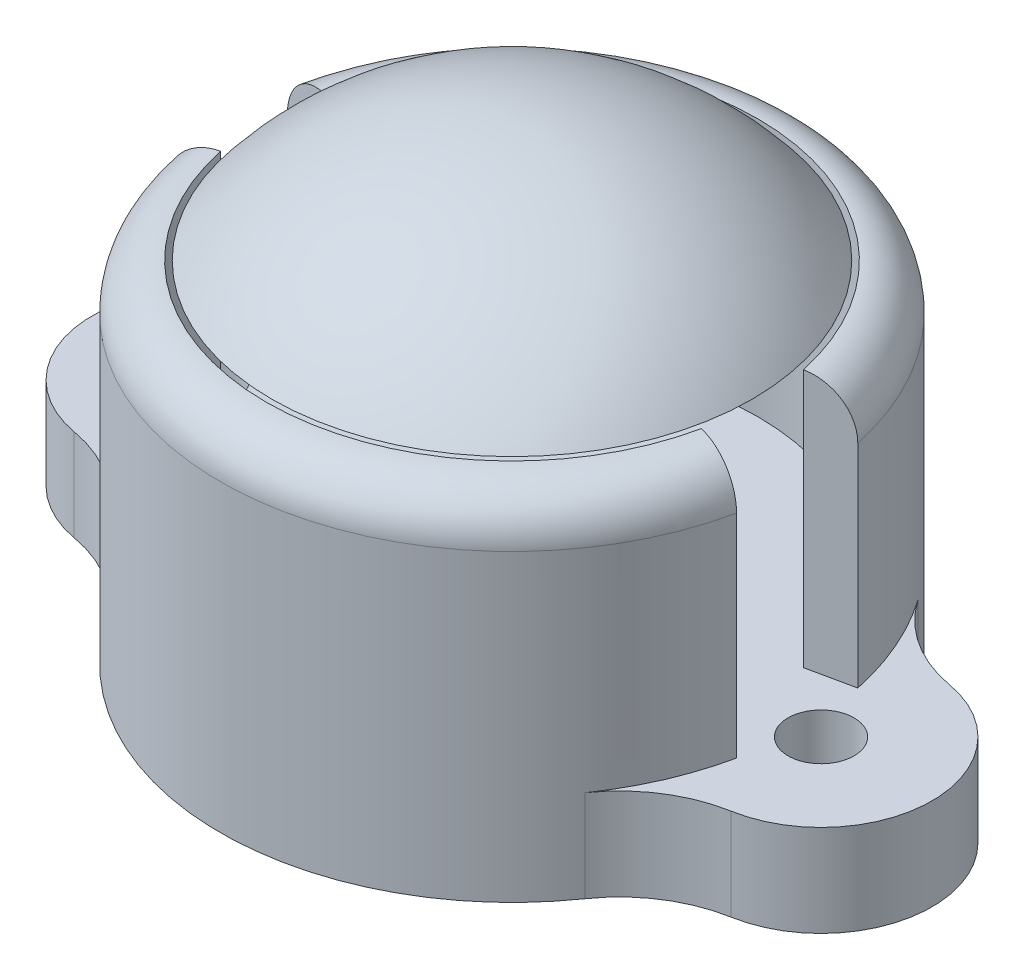
ISO-10303-21;
HEADER;
FILE_DESCRIPTION(('STEP AP214'),'2;1');
FILE_NAME('part.step','',(''),(''),'','','');
FILE_SCHEMA(('AUTOMOTIVE_DESIGN { 1 0 10303 214 1 1 1 1 }'));
ENDSEC;
DATA;
#1=APPLICATION_CONTEXT('core data for automotive mechanical design processes');
#2=APPLICATION_PROTOCOL_DEFINITION('international standard','automotive_design',2000,#1);
#3=PRODUCT_CONTEXT('',#1,'mechanical');
#4=PRODUCT('Part','Part','',(#3));
#5=PRODUCT_RELATED_PRODUCT_CATEGORY('part','',(#4));
#6=PRODUCT_DEFINITION_FORMATION('','',#4);
#7=PRODUCT_DEFINITION_CONTEXT('part definition',#1,'design');
#8=PRODUCT_DEFINITION('design','',#6,#7);
#9=PRODUCT_DEFINITION_SHAPE('','',#8);
#10=(LENGTH_UNIT() NAMED_UNIT(*) SI_UNIT(.MILLI.,.METRE.));
#11=(NAMED_UNIT(*) PLANE_ANGLE_UNIT() SI_UNIT($,.RADIAN.));
#12=(NAMED_UNIT(*) SI_UNIT($,.STERADIAN.) SOLID_ANGLE_UNIT());
#13=UNCERTAINTY_MEASURE_WITH_UNIT(LENGTH_MEASURE(1.E-05),#10,'distance_accuracy_value','');
#14=(GEOMETRIC_REPRESENTATION_CONTEXT(3) GLOBAL_UNCERTAINTY_ASSIGNED_CONTEXT((#13)) GLOBAL_UNIT_ASSIGNED_CONTEXT((#10,
#11,#12)) REPRESENTATION_CONTEXT('',''));
#15=CARTESIAN_POINT('',(0.,0.,0.));
#16=DIRECTION('',(0.,0.,1.));
#17=DIRECTION('',(1.,0.,0.));
#18=AXIS2_PLACEMENT_3D('',#15,#16,#17);
#19=CARTESIAN_POINT('',(0.,3.49920719868355,0.));
#20=DIRECTION('',(0.,1.,0.));
#21=DIRECTION('',(-1.,0.,0.));
#22=AXIS2_PLACEMENT_3D('',#19,#20,#21);
#23=SPHERICAL_SURFACE('',#22,6.66079280131645);
#24=CARTESIAN_POINT('',(0.,7.61999999999999,0.));
#25=DIRECTION('',(0.,1.,0.));
#26=DIRECTION('',(-1.,0.,0.));
#27=AXIS2_PLACEMENT_3D('',#24,#25,#26);
#28=CIRCLE('',#27,5.23308966392588);
#29=CARTESIAN_POINT('',(-5.23308966392587,7.62,0.));
#30=VERTEX_POINT('',#29);
#31=EDGE_CURVE('E11',#30,#30,#28,.T.);
#32=ORIENTED_EDGE('',*,*,#31,.T.);
#33=EDGE_LOOP('',(#32));
#34=FACE_BOUND('',#33,.T.);
#35=ADVANCED_FACE('F45',(#34),#23,.T.);
#36=CARTESIAN_POINT('',(0.,7.62,0.));
#37=DIRECTION('',(0.,-1.,0.));
#38=DIRECTION('',(1.,0.,0.));
#39=AXIS2_PLACEMENT_3D('',#36,#37,#38);
#40=PLANE('',#39);
#41=ORIENTED_EDGE('',*,*,#31,.F.);
#42=EDGE_LOOP('',(#41));
#43=FACE_BOUND('',#42,.T.);
#44=ADVANCED_FACE('F53',(#43),#40,.T.);
#45=CLOSED_SHELL('',(#35,#44));
#46=MANIFOLD_SOLID_BREP('B2',#45);
#47=CARTESIAN_POINT('',(-3.83983426607997,2.,-2.66670167229822));
#48=DIRECTION('',(0.,1.,0.));
#49=DIRECTION('',(0.,0.,1.));
#50=AXIS2_PLACEMENT_3D('',#47,#48,#49);
#51=PLANE('',#50);
#52=CARTESIAN_POINT('',(6.731,2.,0.));
#53=DIRECTION('',(0.,1.,0.));
#54=DIRECTION('',(0.,0.,-1.));
#55=AXIS2_PLACEMENT_3D('',#52,#53,#54);
#56=CIRCLE('',#55,0.718132591921764);
#57=CARTESIAN_POINT('',(6.731,2.,-0.718132591921764));
#58=VERTEX_POINT('',#57);
#59=EDGE_CURVE('E249',#58,#58,#56,.T.);
#60=ORIENTED_EDGE('',*,*,#59,.F.);
#61=EDGE_LOOP('',(#60));
#62=FACE_BOUND('',#61,.T.);
#63=CARTESIAN_POINT('',(-6.731,2.,0.));
#64=DIRECTION('',(0.,1.,0.));
#65=DIRECTION('',(0.,0.,1.));
#66=AXIS2_PLACEMENT_3D('',#63,#64,#65);
#67=CIRCLE('',#66,0.718132591921764);
#68=CARTESIAN_POINT('',(-6.731,2.,0.718132591921764));
#69=VERTEX_POINT('',#68);
#70=EDGE_CURVE('E346',#69,#69,#67,.T.);
#71=ORIENTED_EDGE('',*,*,#70,.F.);
#72=EDGE_LOOP('',(#71));
#73=FACE_BOUND('',#72,.T.);
#74=CARTESIAN_POINT('',(-7.67966853215993,2.,5.33340334459644));
#75=DIRECTION('',(0.,-1.,0.));
#76=DIRECTION('',(0.,0.,-1.));
#77=AXIS2_PLACEMENT_3D('',#74,#75,#76);
#78=CIRCLE('',#77,3.);
#79=CARTESIAN_POINT('',(-7.15429585236415,2.,2.37976430989294));
#80=VERTEX_POINT('',#79);
#81=CARTESIAN_POINT('',(-5.21560376248295,2.,3.6221509345655));
#82=VERTEX_POINT('',#81);
#83=EDGE_CURVE('E297',#80,#82,#78,.T.);
#84=ORIENTED_EDGE('',*,*,#83,.T.);
#85=CARTESIAN_POINT('',(0.,2.,0.));
#86=DIRECTION('',(0.,1.,0.));
#87=DIRECTION('',(0.,0.,1.));
#88=AXIS2_PLACEMENT_3D('',#85,#86,#87);
#89=CIRCLE('',#88,6.35);
#90=CARTESIAN_POINT('',(-6.21123726465967,2.,1.32023923669273));
#91=VERTEX_POINT('',#90);
#92=EDGE_CURVE('E212',#91,#82,#89,.T.);
#93=ORIENTED_EDGE('',*,*,#92,.F.);
#94=DIRECTION('',(-0.978147600733807,0.,0.207911690817752));
#95=VECTOR('',#94,1.);
#96=CARTESIAN_POINT('',(-5.23308966392587,2.,1.11232754587498));
#97=LINE('',#96,#95);
#98=CARTESIAN_POINT('',(-5.23308966392587,2.,1.11232754587498));
#99=VERTEX_POINT('',#98);
#100=EDGE_CURVE('E216',#99,#91,#97,.T.);
#101=ORIENTED_EDGE('',*,*,#100,.F.);
#102=CARTESIAN_POINT('',(0.,2.,0.));
#103=DIRECTION('',(0.,-1.,0.));
#104=DIRECTION('',(0.,0.,1.));
#105=AXIS2_PLACEMENT_3D('',#102,#103,#104);
#106=CIRCLE('',#105,5.35);
#107=CARTESIAN_POINT('',(5.23308966392587,2.,1.11232754587498));
#108=VERTEX_POINT('',#107);
#109=EDGE_CURVE('E200',#108,#99,#106,.T.);
#110=ORIENTED_EDGE('',*,*,#109,.F.);
#111=DIRECTION('',(-0.978147600733807,0.,-0.207911690817752));
#112=VECTOR('',#111,1.);
#113=CARTESIAN_POINT('',(5.23308966392587,2.,1.11232754587498));
#114=LINE('',#113,#112);
#115=CARTESIAN_POINT('',(6.21123726465968,2.,1.32023923669273));
#116=VERTEX_POINT('',#115);
#117=EDGE_CURVE('E207',#116,#108,#114,.T.);
#118=ORIENTED_EDGE('',*,*,#117,.F.);
#119=CARTESIAN_POINT('',(5.21560376248295,2.,3.62215093456549));
#120=VERTEX_POINT('',#119);
#121=EDGE_CURVE('E218',#120,#116,#89,.T.);
#122=ORIENTED_EDGE('',*,*,#121,.F.);
#123=CARTESIAN_POINT('',(7.67966853215994,2.,5.33340334459644));
#124=DIRECTION('',(0.,-1.,0.));
#125=DIRECTION('',(0.,0.,1.));
#126=AXIS2_PLACEMENT_3D('',#123,#124,#125);
#127=CIRCLE('',#126,3.);
#128=CARTESIAN_POINT('',(7.15429585236415,2.,2.37976430989294));
#129=VERTEX_POINT('',#128);
#130=EDGE_CURVE('E353',#120,#129,#127,.T.);
#131=ORIENTED_EDGE('',*,*,#130,.T.);
#132=CARTESIAN_POINT('',(6.731,2.,0.));
#133=DIRECTION('',(0.,1.,0.));
#134=DIRECTION('',(0.,0.,-1.));
#135=AXIS2_PLACEMENT_3D('',#132,#133,#134);
#136=CIRCLE('',#135,2.417117611799);
#137=CARTESIAN_POINT('',(7.15429585236415,2.,-2.37976430989294));
#138=VERTEX_POINT('',#137);
#139=EDGE_CURVE('E275',#129,#138,#136,.T.);
#140=ORIENTED_EDGE('',*,*,#139,.T.);
#141=CARTESIAN_POINT('',(7.67966853215994,2.,-5.33340334459644));
#142=DIRECTION('',(0.,-1.,0.));
#143=DIRECTION('',(0.,0.,1.));
#144=AXIS2_PLACEMENT_3D('',#141,#142,#143);
#145=CIRCLE('',#144,3.);
#146=CARTESIAN_POINT('',(5.21560376248295,2.,-3.62215093456549));
#147=VERTEX_POINT('',#146);
#148=EDGE_CURVE('E264',#138,#147,#145,.T.);
#149=ORIENTED_EDGE('',*,*,#148,.T.);
#150=CARTESIAN_POINT('',(0.,2.,0.));
#151=DIRECTION('',(0.,1.,0.));
#152=DIRECTION('',(0.,0.,-1.));
#153=AXIS2_PLACEMENT_3D('',#150,#151,#152);
#154=CIRCLE('',#153,6.35);
#155=CARTESIAN_POINT('',(6.21123726465968,2.,-1.32023923669273));
#156=VERTEX_POINT('',#155);
#157=EDGE_CURVE('E201',#156,#147,#154,.T.);
#158=ORIENTED_EDGE('',*,*,#157,.F.);
#159=DIRECTION('',(0.978147600733807,0.,-0.207911690817752));
#160=VECTOR('',#159,1.);
#161=CARTESIAN_POINT('',(5.23308966392587,2.,-1.11232754587498));
#162=LINE('',#161,#160);
#163=CARTESIAN_POINT('',(5.23308966392587,2.,-1.11232754587498));
#164=VERTEX_POINT('',#163);
#165=EDGE_CURVE('E227',#164,#156,#162,.T.);
#166=ORIENTED_EDGE('',*,*,#165,.F.);
#167=CARTESIAN_POINT('',(0.,2.,0.));
#168=DIRECTION('',(0.,-1.,0.));
#169=DIRECTION('',(0.,0.,-1.));
#170=AXIS2_PLACEMENT_3D('',#167,#168,#169);
#171=CIRCLE('',#170,5.35);
#172=CARTESIAN_POINT('',(-5.23308966392587,2.,-1.11232754587498));
#173=VERTEX_POINT('',#172);
#174=EDGE_CURVE('E231',#173,#164,#171,.T.);
#175=ORIENTED_EDGE('',*,*,#174,.F.);
#176=DIRECTION('',(0.978147600733807,0.,0.207911690817752));
#177=VECTOR('',#176,1.);
#178=CARTESIAN_POINT('',(-5.23308966392587,2.,-1.11232754587498));
#179=LINE('',#178,#177);
#180=CARTESIAN_POINT('',(-6.21123726465968,2.,-1.32023923669273));
#181=VERTEX_POINT('',#180);
#182=EDGE_CURVE('E228',#181,#173,#179,.T.);
#183=ORIENTED_EDGE('',*,*,#182,.F.);
#184=CARTESIAN_POINT('',(-5.21560376248295,2.,-3.62215093456549));
#185=VERTEX_POINT('',#184);
#186=EDGE_CURVE('E256',#185,#181,#154,.T.);
#187=ORIENTED_EDGE('',*,*,#186,.F.);
#188=CARTESIAN_POINT('',(-7.67966853215994,2.,-5.33340334459644));
#189=DIRECTION('',(0.,-1.,0.));
#190=DIRECTION('',(0.,0.,1.));
#191=AXIS2_PLACEMENT_3D('',#188,#189,#190);
#192=CIRCLE('',#191,3.);
#193=CARTESIAN_POINT('',(-7.15429585236415,2.,-2.37976430989294));
#194=VERTEX_POINT('',#193);
#195=EDGE_CURVE('E267',#185,#194,#192,.T.);
#196=ORIENTED_EDGE('',*,*,#195,.T.);
#197=CARTESIAN_POINT('',(-6.731,2.,0.));
#198=DIRECTION('',(0.,1.,0.));
#199=DIRECTION('',(0.,0.,1.));
#200=AXIS2_PLACEMENT_3D('',#197,#198,#199);
#201=CIRCLE('',#200,2.41711761179901);
#202=EDGE_CURVE('E270',#194,#80,#201,.T.);
#203=ORIENTED_EDGE('',*,*,#202,.T.);
#204=EDGE_LOOP('',(#84,#93,#101,#110,#118,#122,#131,#140,#149,#158,#166,#175,#183,#187,#196,#203));
#205=FACE_BOUND('',#204,.T.);
#206=ADVANCED_FACE('F71',(#62,#73,#205),#51,.T.);
#207=CARTESIAN_POINT('',(-3.83983426607997,0.,-2.66670167229822));
#208=DIRECTION('',(0.,1.,0.));
#209=DIRECTION('',(0.,0.,1.));
#210=AXIS2_PLACEMENT_3D('',#207,#208,#209);
#211=PLANE('',#210);
#212=CARTESIAN_POINT('',(-6.731,0.,0.));
#213=DIRECTION('',(0.,1.,0.));
#214=DIRECTION('',(0.,0.,1.));
#215=AXIS2_PLACEMENT_3D('',#212,#213,#214);
#216=CIRCLE('',#215,0.718132591921764);
#217=CARTESIAN_POINT('',(-6.731,0.,0.718132591921764));
#218=VERTEX_POINT('',#217);
#219=EDGE_CURVE('E349',#218,#218,#216,.T.);
#220=ORIENTED_EDGE('',*,*,#219,.T.);
#221=EDGE_LOOP('',(#220));
#222=FACE_BOUND('',#221,.T.);
#223=CARTESIAN_POINT('',(-7.67966853215994,0.,-5.33340334459644));
#224=DIRECTION('',(0.,-1.,0.));
#225=DIRECTION('',(0.,0.,1.));
#226=AXIS2_PLACEMENT_3D('',#223,#224,#225);
#227=CIRCLE('',#226,3.);
#228=CARTESIAN_POINT('',(-5.21560376248295,0.,-3.62215093456549));
#229=VERTEX_POINT('',#228);
#230=CARTESIAN_POINT('',(-7.15429585236415,0.,-2.37976430989294));
#231=VERTEX_POINT('',#230);
#232=EDGE_CURVE('E342',#229,#231,#227,.T.);
#233=ORIENTED_EDGE('',*,*,#232,.F.);
#234=CARTESIAN_POINT('',(0.,0.,0.));
#235=DIRECTION('',(0.,1.,0.));
#236=DIRECTION('',(0.,0.,-1.));
#237=AXIS2_PLACEMENT_3D('',#234,#235,#236);
#238=CIRCLE('',#237,6.35);
#239=CARTESIAN_POINT('',(5.21560376248295,0.,-3.62215093456549));
#240=VERTEX_POINT('',#239);
#241=EDGE_CURVE('E271',#240,#229,#238,.T.);
#242=ORIENTED_EDGE('',*,*,#241,.F.);
#243=CARTESIAN_POINT('',(7.67966853215994,0.,-5.33340334459644));
#244=DIRECTION('',(0.,-1.,0.));
#245=DIRECTION('',(0.,0.,1.));
#246=AXIS2_PLACEMENT_3D('',#243,#244,#245);
#247=CIRCLE('',#246,3.);
#248=CARTESIAN_POINT('',(7.15429585236415,0.,-2.37976430989294));
#249=VERTEX_POINT('',#248);
#250=EDGE_CURVE('E325',#249,#240,#247,.T.);
#251=ORIENTED_EDGE('',*,*,#250,.F.);
#252=CARTESIAN_POINT('',(6.731,0.,0.));
#253=DIRECTION('',(0.,1.,0.));
#254=DIRECTION('',(0.,0.,-1.));
#255=AXIS2_PLACEMENT_3D('',#252,#253,#254);
#256=CIRCLE('',#255,2.417117611799);
#257=CARTESIAN_POINT('',(7.15429585236415,0.,2.37976430989294));
#258=VERTEX_POINT('',#257);
#259=EDGE_CURVE('E318',#258,#249,#256,.T.);
#260=ORIENTED_EDGE('',*,*,#259,.F.);
#261=CARTESIAN_POINT('',(7.67966853215994,0.,5.33340334459644));
#262=DIRECTION('',(0.,-1.,0.));
#263=DIRECTION('',(0.,0.,1.));
#264=AXIS2_PLACEMENT_3D('',#261,#262,#263);
#265=CIRCLE('',#264,3.);
#266=CARTESIAN_POINT('',(5.21560376248295,0.,3.62215093456549));
#267=VERTEX_POINT('',#266);
#268=EDGE_CURVE('E316',#267,#258,#265,.T.);
#269=ORIENTED_EDGE('',*,*,#268,.F.);
#270=CARTESIAN_POINT('',(0.,0.,0.));
#271=DIRECTION('',(0.,1.,0.));
#272=DIRECTION('',(0.,0.,1.));
#273=AXIS2_PLACEMENT_3D('',#270,#271,#272);
#274=CIRCLE('',#273,6.35);
#275=CARTESIAN_POINT('',(-5.21560376248295,0.,3.6221509345655));
#276=VERTEX_POINT('',#275);
#277=EDGE_CURVE('E302',#276,#267,#274,.T.);
#278=ORIENTED_EDGE('',*,*,#277,.F.);
#279=CARTESIAN_POINT('',(-7.67966853215993,0.,5.33340334459644));
#280=DIRECTION('',(0.,-1.,0.));
#281=DIRECTION('',(0.,0.,-1.));
#282=AXIS2_PLACEMENT_3D('',#279,#280,#281);
#283=CIRCLE('',#282,3.);
#284=CARTESIAN_POINT('',(-7.15429585236415,0.,2.37976430989294));
#285=VERTEX_POINT('',#284);
#286=EDGE_CURVE('E314',#285,#276,#283,.T.);
#287=ORIENTED_EDGE('',*,*,#286,.F.);
#288=CARTESIAN_POINT('',(-6.731,0.,0.));
#289=DIRECTION('',(0.,1.,0.));
#290=DIRECTION('',(0.,0.,1.));
#291=AXIS2_PLACEMENT_3D('',#288,#289,#290);
#292=CIRCLE('',#291,2.41711761179901);
#293=EDGE_CURVE('E320',#231,#285,#292,.T.);
#294=ORIENTED_EDGE('',*,*,#293,.F.);
#295=EDGE_LOOP('',(#233,#242,#251,#260,#269,#278,#287,#294));
#296=FACE_BOUND('',#295,.T.);
#297=CARTESIAN_POINT('',(6.731,0.,0.));
#298=DIRECTION('',(0.,1.,0.));
#299=DIRECTION('',(0.,0.,-1.));
#300=AXIS2_PLACEMENT_3D('',#297,#298,#299);
#301=CIRCLE('',#300,0.718132591921764);
#302=CARTESIAN_POINT('',(6.731,0.,-0.718132591921764));
#303=VERTEX_POINT('',#302);
#304=EDGE_CURVE('E245',#303,#303,#301,.T.);
#305=ORIENTED_EDGE('',*,*,#304,.T.);
#306=EDGE_LOOP('',(#305));
#307=FACE_BOUND('',#306,.T.);
#308=ADVANCED_FACE('F312',(#222,#296,#307),#211,.F.);
#309=CARTESIAN_POINT('',(-7.67966853215994,2.,-5.33340334459644));
#310=DIRECTION('',(0.,-1.,0.));
#311=DIRECTION('',(0.,0.,-1.));
#312=AXIS2_PLACEMENT_3D('',#309,#310,#311);
#313=CYLINDRICAL_SURFACE('',#312,3.);
#314=ORIENTED_EDGE('',*,*,#232,.T.);
#315=DIRECTION('',(0.,-1.,0.));
#316=VECTOR('',#315,1.);
#317=CARTESIAN_POINT('',(-7.15429585236415,2.,-2.37976430989294));
#318=LINE('',#317,#316);
#319=EDGE_CURVE('E254',#194,#231,#318,.T.);
#320=ORIENTED_EDGE('',*,*,#319,.F.);
#321=ORIENTED_EDGE('',*,*,#195,.F.);
#322=DIRECTION('',(0.,-1.,0.));
#323=VECTOR('',#322,1.);
#324=CARTESIAN_POINT('',(-5.21560376248295,2.,-3.62215093456549));
#325=LINE('',#324,#323);
#326=EDGE_CURVE('E260',#185,#229,#325,.T.);
#327=ORIENTED_EDGE('',*,*,#326,.T.);
#328=EDGE_LOOP('',(#314,#320,#321,#327));
#329=FACE_BOUND('',#328,.T.);
#330=ADVANCED_FACE('F343',(#329),#313,.F.);
#331=CARTESIAN_POINT('',(-6.731,2.,0.));
#332=DIRECTION('',(0.,-1.,0.));
#333=DIRECTION('',(0.,0.,-1.));
#334=AXIS2_PLACEMENT_3D('',#331,#332,#333);
#335=CYLINDRICAL_SURFACE('',#334,2.41711761179901);
#336=ORIENTED_EDGE('',*,*,#293,.T.);
#337=DIRECTION('',(0.,-1.,0.));
#338=VECTOR('',#337,1.);
#339=CARTESIAN_POINT('',(-7.15429585236415,2.,2.37976430989294));
#340=LINE('',#339,#338);
#341=EDGE_CURVE('E305',#80,#285,#340,.T.);
#342=ORIENTED_EDGE('',*,*,#341,.F.);
#343=ORIENTED_EDGE('',*,*,#202,.F.);
#344=ORIENTED_EDGE('',*,*,#319,.T.);
#345=EDGE_LOOP('',(#336,#342,#343,#344));
#346=FACE_BOUND('',#345,.T.);
#347=ADVANCED_FACE('F339',(#346),#335,.T.);
#348=CARTESIAN_POINT('',(-7.67966853215993,2.,5.33340334459644));
#349=DIRECTION('',(0.,-1.,0.));
#350=DIRECTION('',(0.,0.,-1.));
#351=AXIS2_PLACEMENT_3D('',#348,#349,#350);
#352=CYLINDRICAL_SURFACE('',#351,3.);
#353=ORIENTED_EDGE('',*,*,#286,.T.);
#354=DIRECTION('',(0.,-1.,0.));
#355=VECTOR('',#354,1.);
#356=CARTESIAN_POINT('',(-5.21560376248295,2.,3.6221509345655));
#357=LINE('',#356,#355);
#358=EDGE_CURVE('E300',#82,#276,#357,.T.);
#359=ORIENTED_EDGE('',*,*,#358,.F.);
#360=ORIENTED_EDGE('',*,*,#83,.F.);
#361=ORIENTED_EDGE('',*,*,#341,.T.);
#362=EDGE_LOOP('',(#353,#359,#360,#361));
#363=FACE_BOUND('',#362,.T.);
#364=ADVANCED_FACE('F401',(#363),#352,.F.);
#365=CARTESIAN_POINT('',(0.,2.,0.));
#366=DIRECTION('',(0.,-1.,0.));
#367=DIRECTION('',(0.,0.,-1.));
#368=AXIS2_PLACEMENT_3D('',#365,#366,#367);
#369=CYLINDRICAL_SURFACE('',#368,6.35);
#370=DIRECTION('',(0.,-1.,0.));
#371=VECTOR('',#370,1.);
#372=CARTESIAN_POINT('',(6.21123726465968,7.62,1.32023923669273));
#373=LINE('',#372,#371);
#374=CARTESIAN_POINT('',(6.21123726465968,6.62,1.32023923669273));
#375=VERTEX_POINT('',#374);
#376=EDGE_CURVE('E209',#375,#116,#373,.T.);
#377=ORIENTED_EDGE('',*,*,#376,.F.);
#378=CARTESIAN_POINT('',(0.,6.62,0.));
#379=DIRECTION('',(0.,1.,0.));
#380=DIRECTION('',(0.,0.,1.));
#381=AXIS2_PLACEMENT_3D('',#378,#379,#380);
#382=CIRCLE('',#381,6.35);
#383=CARTESIAN_POINT('',(-6.21123726465968,6.62,1.32023923669273));
#384=VERTEX_POINT('',#383);
#385=EDGE_CURVE('E193',#375,#384,#382,.F.);
#386=ORIENTED_EDGE('',*,*,#385,.T.);
#387=DIRECTION('',(0.,-1.,0.));
#388=VECTOR('',#387,1.);
#389=CARTESIAN_POINT('',(-6.21123726465968,7.62,1.32023923669273));
#390=LINE('',#389,#388);
#391=EDGE_CURVE('E189',#384,#91,#390,.T.);
#392=ORIENTED_EDGE('',*,*,#391,.T.);
#393=ORIENTED_EDGE('',*,*,#92,.T.);
#394=ORIENTED_EDGE('',*,*,#358,.T.);
#395=ORIENTED_EDGE('',*,*,#277,.T.);
#396=DIRECTION('',(0.,-1.,0.));
#397=VECTOR('',#396,1.);
#398=CARTESIAN_POINT('',(5.21560376248295,2.,3.62215093456549));
#399=LINE('',#398,#397);
#400=EDGE_CURVE('E306',#120,#267,#399,.T.);
#401=ORIENTED_EDGE('',*,*,#400,.F.);
#402=ORIENTED_EDGE('',*,*,#121,.T.);
#403=EDGE_LOOP('',(#377,#386,#392,#393,#394,#395,#401,#402));
#404=FACE_BOUND('',#403,.T.);
#405=ADVANCED_FACE('F287',(#404),#369,.T.);
#406=CARTESIAN_POINT('',(7.67966853215994,2.,5.33340334459644));
#407=DIRECTION('',(0.,-1.,0.));
#408=DIRECTION('',(0.,0.,-1.));
#409=AXIS2_PLACEMENT_3D('',#406,#407,#408);
#410=CYLINDRICAL_SURFACE('',#409,3.);
#411=ORIENTED_EDGE('',*,*,#268,.T.);
#412=DIRECTION('',(0.,-1.,0.));
#413=VECTOR('',#412,1.);
#414=CARTESIAN_POINT('',(7.15429585236415,2.,2.37976430989294));
#415=LINE('',#414,#413);
#416=EDGE_CURVE('E330',#129,#258,#415,.T.);
#417=ORIENTED_EDGE('',*,*,#416,.F.);
#418=ORIENTED_EDGE('',*,*,#130,.F.);
#419=ORIENTED_EDGE('',*,*,#400,.T.);
#420=EDGE_LOOP('',(#411,#417,#418,#419));
#421=FACE_BOUND('',#420,.T.);
#422=ADVANCED_FACE('F394',(#421),#410,.F.);
#423=CARTESIAN_POINT('',(6.731,2.,0.));
#424=DIRECTION('',(0.,-1.,0.));
#425=DIRECTION('',(0.,0.,-1.));
#426=AXIS2_PLACEMENT_3D('',#423,#424,#425);
#427=CYLINDRICAL_SURFACE('',#426,2.417117611799);
#428=ORIENTED_EDGE('',*,*,#259,.T.);
#429=DIRECTION('',(0.,-1.,0.));
#430=VECTOR('',#429,1.);
#431=CARTESIAN_POINT('',(7.15429585236415,2.,-2.37976430989294));
#432=LINE('',#431,#430);
#433=EDGE_CURVE('E280',#138,#249,#432,.T.);
#434=ORIENTED_EDGE('',*,*,#433,.F.);
#435=ORIENTED_EDGE('',*,*,#139,.F.);
#436=ORIENTED_EDGE('',*,*,#416,.T.);
#437=EDGE_LOOP('',(#428,#434,#435,#436));
#438=FACE_BOUND('',#437,.T.);
#439=ADVANCED_FACE('F390',(#438),#427,.T.);
#440=CARTESIAN_POINT('',(7.67966853215994,2.,-5.33340334459644));
#441=DIRECTION('',(0.,-1.,0.));
#442=DIRECTION('',(0.,0.,-1.));
#443=AXIS2_PLACEMENT_3D('',#440,#441,#442);
#444=CYLINDRICAL_SURFACE('',#443,3.);
#445=ORIENTED_EDGE('',*,*,#250,.T.);
#446=DIRECTION('',(0.,-1.,0.));
#447=VECTOR('',#446,1.);
#448=CARTESIAN_POINT('',(5.21560376248295,2.,-3.62215093456549));
#449=LINE('',#448,#447);
#450=EDGE_CURVE('E263',#147,#240,#449,.T.);
#451=ORIENTED_EDGE('',*,*,#450,.F.);
#452=ORIENTED_EDGE('',*,*,#148,.F.);
#453=ORIENTED_EDGE('',*,*,#433,.T.);
#454=EDGE_LOOP('',(#445,#451,#452,#453));
#455=FACE_BOUND('',#454,.T.);
#456=ADVANCED_FACE('F387',(#455),#444,.F.);
#457=CARTESIAN_POINT('',(0.,2.,0.));
#458=DIRECTION('',(0.,-1.,0.));
#459=DIRECTION('',(0.,0.,-1.));
#460=AXIS2_PLACEMENT_3D('',#457,#458,#459);
#461=CYLINDRICAL_SURFACE('',#460,6.35);
#462=DIRECTION('',(0.,-1.,0.));
#463=VECTOR('',#462,1.);
#464=CARTESIAN_POINT('',(-6.21123726465968,7.62,-1.32023923669273));
#465=LINE('',#464,#463);
#466=CARTESIAN_POINT('',(-6.21123726465968,6.62,-1.32023923669273));
#467=VERTEX_POINT('',#466);
#468=EDGE_CURVE('E243',#467,#181,#465,.T.);
#469=ORIENTED_EDGE('',*,*,#468,.F.);
#470=CARTESIAN_POINT('',(0.,6.62,0.));
#471=DIRECTION('',(0.,-1.,0.));
#472=DIRECTION('',(0.,0.,-1.));
#473=AXIS2_PLACEMENT_3D('',#470,#471,#472);
#474=CIRCLE('',#473,6.35);
#475=CARTESIAN_POINT('',(6.21123726465968,6.62,-1.32023923669273));
#476=VERTEX_POINT('',#475);
#477=EDGE_CURVE('E79',#467,#476,#474,.T.);
#478=ORIENTED_EDGE('',*,*,#477,.T.);
#479=DIRECTION('',(0.,-1.,0.));
#480=VECTOR('',#479,1.);
#481=CARTESIAN_POINT('',(6.21123726465968,7.62,-1.32023923669273));
#482=LINE('',#481,#480);
#483=EDGE_CURVE('E226',#476,#156,#482,.T.);
#484=ORIENTED_EDGE('',*,*,#483,.T.);
#485=ORIENTED_EDGE('',*,*,#157,.T.);
#486=ORIENTED_EDGE('',*,*,#450,.T.);
#487=ORIENTED_EDGE('',*,*,#241,.T.);
#488=ORIENTED_EDGE('',*,*,#326,.F.);
#489=ORIENTED_EDGE('',*,*,#186,.T.);
#490=EDGE_LOOP('',(#469,#478,#484,#485,#486,#487,#488,#489));
#491=FACE_BOUND('',#490,.T.);
#492=ADVANCED_FACE('F374',(#491),#461,.T.);
#493=CARTESIAN_POINT('',(-6.731,2.,0.));
#494=DIRECTION('',(0.,-1.,0.));
#495=DIRECTION('',(0.,0.,-1.));
#496=AXIS2_PLACEMENT_3D('',#493,#494,#495);
#497=CYLINDRICAL_SURFACE('',#496,0.718132591921764);
#498=ORIENTED_EDGE('',*,*,#70,.T.);
#499=EDGE_LOOP('',(#498));
#500=FACE_BOUND('',#499,.T.);
#501=ORIENTED_EDGE('',*,*,#219,.F.);
#502=EDGE_LOOP('',(#501));
#503=FACE_BOUND('',#502,.T.);
#504=ADVANCED_FACE('F371',(#500,#503),#497,.F.);
#505=CARTESIAN_POINT('',(6.731,2.,0.));
#506=DIRECTION('',(0.,-1.,0.));
#507=DIRECTION('',(0.,0.,-1.));
#508=AXIS2_PLACEMENT_3D('',#505,#506,#507);
#509=CYLINDRICAL_SURFACE('',#508,0.718132591921764);
#510=ORIENTED_EDGE('',*,*,#59,.T.);
#511=EDGE_LOOP('',(#510));
#512=FACE_BOUND('',#511,.T.);
#513=ORIENTED_EDGE('',*,*,#304,.F.);
#514=EDGE_LOOP('',(#513));
#515=FACE_BOUND('',#514,.T.);
#516=ADVANCED_FACE('F363',(#512,#515),#509,.F.);
#517=CARTESIAN_POINT('',(-5.23308966392587,7.62,-1.11232754587498));
#518=DIRECTION('',(0.207911690817752,0.,-0.978147600733807));
#519=DIRECTION('',(-0.978147600733807,0.,-0.207911690817752));
#520=AXIS2_PLACEMENT_3D('',#517,#518,#519);
#521=PLANE('',#520);
#522=DIRECTION('',(0.,-1.,0.));
#523=VECTOR('',#522,1.);
#524=CARTESIAN_POINT('',(-5.23308966392587,7.62,-1.11232754587498));
#525=LINE('',#524,#523);
#526=CARTESIAN_POINT('',(-5.23308966392587,7.62,-1.11232754587498));
#527=VERTEX_POINT('',#526);
#528=EDGE_CURVE('E240',#527,#173,#525,.T.);
#529=ORIENTED_EDGE('',*,*,#528,.F.);
#530=CARTESIAN_POINT('',(-5.23308966392587,6.62,-1.11232754587497));
#531=DIRECTION('',(0.207911690817752,0.,-0.978147600733807));
#532=DIRECTION('',(-0.978147600733807,0.,-0.207911690817752));
#533=AXIS2_PLACEMENT_3D('',#530,#531,#532);
#534=CIRCLE('',#533,1.);
#535=EDGE_CURVE('E93',#527,#467,#534,.F.);
#536=ORIENTED_EDGE('',*,*,#535,.T.);
#537=ORIENTED_EDGE('',*,*,#468,.T.);
#538=ORIENTED_EDGE('',*,*,#182,.T.);
#539=EDGE_LOOP('',(#529,#536,#537,#538));
#540=FACE_BOUND('',#539,.T.);
#541=ADVANCED_FACE('F426',(#540),#521,.F.);
#542=CARTESIAN_POINT('',(0.,7.62,0.));
#543=DIRECTION('',(0.,-1.,0.));
#544=DIRECTION('',(0.,0.,-1.));
#545=AXIS2_PLACEMENT_3D('',#542,#543,#544);
#546=CYLINDRICAL_SURFACE('',#545,5.35);
#547=ORIENTED_EDGE('',*,*,#174,.T.);
#548=DIRECTION('',(0.,-1.,0.));
#549=VECTOR('',#548,1.);
#550=CARTESIAN_POINT('',(5.23308966392587,7.62,-1.11232754587498));
#551=LINE('',#550,#549);
#552=CARTESIAN_POINT('',(5.23308966392587,7.62,-1.11232754587498));
#553=VERTEX_POINT('',#552);
#554=EDGE_CURVE('E237',#553,#164,#551,.T.);
#555=ORIENTED_EDGE('',*,*,#554,.F.);
#556=CARTESIAN_POINT('',(0.,7.62,0.));
#557=DIRECTION('',(0.,-1.,0.));
#558=DIRECTION('',(0.,0.,-1.));
#559=AXIS2_PLACEMENT_3D('',#556,#557,#558);
#560=CIRCLE('',#559,5.35);
#561=EDGE_CURVE('E223',#527,#553,#560,.T.);
#562=ORIENTED_EDGE('',*,*,#561,.F.);
#563=ORIENTED_EDGE('',*,*,#528,.T.);
#564=EDGE_LOOP('',(#547,#555,#562,#563));
#565=FACE_BOUND('',#564,.T.);
#566=ADVANCED_FACE('F422',(#565),#546,.F.);
#567=CARTESIAN_POINT('',(5.23308966392587,7.62,-1.11232754587498));
#568=DIRECTION('',(-0.207911690817752,0.,-0.978147600733807));
#569=DIRECTION('',(-0.978147600733807,0.,0.207911690817752));
#570=AXIS2_PLACEMENT_3D('',#567,#568,#569);
#571=PLANE('',#570);
#572=ORIENTED_EDGE('',*,*,#483,.F.);
#573=CARTESIAN_POINT('',(5.23308966392587,6.62,-1.11232754587497));
#574=DIRECTION('',(-0.207911690817752,0.,-0.978147600733807));
#575=DIRECTION('',(-0.978147600733807,0.,0.207911690817752));
#576=AXIS2_PLACEMENT_3D('',#573,#574,#575);
#577=CIRCLE('',#576,1.);
#578=EDGE_CURVE('E43',#476,#553,#577,.F.);
#579=ORIENTED_EDGE('',*,*,#578,.T.);
#580=ORIENTED_EDGE('',*,*,#554,.T.);
#581=ORIENTED_EDGE('',*,*,#165,.T.);
#582=EDGE_LOOP('',(#572,#579,#580,#581));
#583=FACE_BOUND('',#582,.T.);
#584=ADVANCED_FACE('F419',(#583),#571,.F.);
#585=CARTESIAN_POINT('',(0.,7.62,0.));
#586=DIRECTION('',(0.,-1.,0.));
#587=DIRECTION('',(0.,0.,-1.));
#588=AXIS2_PLACEMENT_3D('',#585,#586,#587);
#589=CYLINDRICAL_SURFACE('',#588,5.35);
#590=ORIENTED_EDGE('',*,*,#109,.T.);
#591=DIRECTION('',(0.,-1.,0.));
#592=VECTOR('',#591,1.);
#593=CARTESIAN_POINT('',(-5.23308966392587,7.62,1.11232754587498));
#594=LINE('',#593,#592);
#595=CARTESIAN_POINT('',(-5.23308966392587,7.62,1.11232754587498));
#596=VERTEX_POINT('',#595);
#597=EDGE_CURVE('E187',#596,#99,#594,.T.);
#598=ORIENTED_EDGE('',*,*,#597,.F.);
#599=CARTESIAN_POINT('',(0.,7.62,0.));
#600=DIRECTION('',(0.,-1.,0.));
#601=DIRECTION('',(0.,0.,1.));
#602=AXIS2_PLACEMENT_3D('',#599,#600,#601);
#603=CIRCLE('',#602,5.35);
#604=CARTESIAN_POINT('',(5.23308966392587,7.62,1.11232754587498));
#605=VERTEX_POINT('',#604);
#606=EDGE_CURVE('E199',#605,#596,#603,.T.);
#607=ORIENTED_EDGE('',*,*,#606,.F.);
#608=DIRECTION('',(0.,-1.,0.));
#609=VECTOR('',#608,1.);
#610=CARTESIAN_POINT('',(5.23308966392587,7.62,1.11232754587498));
#611=LINE('',#610,#609);
#612=EDGE_CURVE('E206',#605,#108,#611,.T.);
#613=ORIENTED_EDGE('',*,*,#612,.T.);
#614=EDGE_LOOP('',(#590,#598,#607,#613));
#615=FACE_BOUND('',#614,.T.);
#616=ADVANCED_FACE('F197',(#615),#589,.F.);
#617=CARTESIAN_POINT('',(-5.23308966392587,7.62,1.11232754587498));
#618=DIRECTION('',(0.207911690817752,0.,0.978147600733807));
#619=DIRECTION('',(0.978147600733807,0.,-0.207911690817752));
#620=AXIS2_PLACEMENT_3D('',#617,#618,#619);
#621=PLANE('',#620);
#622=ORIENTED_EDGE('',*,*,#391,.F.);
#623=CARTESIAN_POINT('',(-5.23308966392587,6.62,1.11232754587497));
#624=DIRECTION('',(0.207911690817752,0.,0.978147600733807));
#625=DIRECTION('',(0.978147600733807,0.,-0.207911690817752));
#626=AXIS2_PLACEMENT_3D('',#623,#624,#625);
#627=CIRCLE('',#626,1.);
#628=EDGE_CURVE('E183',#384,#596,#627,.F.);
#629=ORIENTED_EDGE('',*,*,#628,.T.);
#630=ORIENTED_EDGE('',*,*,#597,.T.);
#631=ORIENTED_EDGE('',*,*,#100,.T.);
#632=EDGE_LOOP('',(#622,#629,#630,#631));
#633=FACE_BOUND('',#632,.T.);
#634=ADVANCED_FACE('F185',(#633),#621,.F.);
#635=CARTESIAN_POINT('',(5.23308966392587,7.62,1.11232754587498));
#636=DIRECTION('',(-0.207911690817752,0.,0.978147600733807));
#637=DIRECTION('',(0.978147600733807,0.,0.207911690817752));
#638=AXIS2_PLACEMENT_3D('',#635,#636,#637);
#639=PLANE('',#638);
#640=ORIENTED_EDGE('',*,*,#612,.F.);
#641=CARTESIAN_POINT('',(5.23308966392587,6.62,1.11232754587497));
#642=DIRECTION('',(-0.207911690817752,0.,0.978147600733807));
#643=DIRECTION('',(0.978147600733807,0.,0.207911690817752));
#644=AXIS2_PLACEMENT_3D('',#641,#642,#643);
#645=CIRCLE('',#644,1.);
#646=EDGE_CURVE('E204',#605,#375,#645,.F.);
#647=ORIENTED_EDGE('',*,*,#646,.T.);
#648=ORIENTED_EDGE('',*,*,#376,.T.);
#649=ORIENTED_EDGE('',*,*,#117,.T.);
#650=EDGE_LOOP('',(#640,#647,#648,#649));
#651=FACE_BOUND('',#650,.T.);
#652=ADVANCED_FACE('F294',(#651),#639,.F.);
#653=CARTESIAN_POINT('',(0.,6.62,0.));
#654=DIRECTION('',(0.,1.,0.));
#655=DIRECTION('',(0.,0.,1.));
#656=AXIS2_PLACEMENT_3D('',#653,#654,#655);
#657=TOROIDAL_SURFACE('',#656,5.35,1.);
#658=ORIENTED_EDGE('',*,*,#628,.F.);
#659=ORIENTED_EDGE('',*,*,#385,.F.);
#660=ORIENTED_EDGE('',*,*,#646,.F.);
#661=ORIENTED_EDGE('',*,*,#606,.T.);
#662=EDGE_LOOP('',(#658,#659,#660,#661));
#663=FACE_BOUND('',#662,.T.);
#664=ADVANCED_FACE('F203',(#663),#657,.T.);
#665=CARTESIAN_POINT('',(0.,6.62,0.));
#666=DIRECTION('',(0.,-1.,0.));
#667=DIRECTION('',(0.,0.,-1.));
#668=AXIS2_PLACEMENT_3D('',#665,#666,#667);
#669=TOROIDAL_SURFACE('',#668,5.35,1.);
#670=ORIENTED_EDGE('',*,*,#578,.F.);
#671=ORIENTED_EDGE('',*,*,#477,.F.);
#672=ORIENTED_EDGE('',*,*,#535,.F.);
#673=ORIENTED_EDGE('',*,*,#561,.T.);
#674=EDGE_LOOP('',(#670,#671,#672,#673));
#675=FACE_BOUND('',#674,.T.);
#676=ADVANCED_FACE('F73',(#675),#669,.T.);
#677=CLOSED_SHELL('',(#206,#308,#330,#347,#364,#405,#422,#439,#456,#492,#504,#516,#541,#566,
#584,#616,#634,#652,#664,#676));
#678=MANIFOLD_SOLID_BREP('B6',#677);
#679=ADVANCED_BREP_SHAPE_REPRESENTATION('',(#18,#46,#678),#14);
#680=SHAPE_DEFINITION_REPRESENTATION(#9,#679);
ENDSEC;
END-ISO-10303-21;
